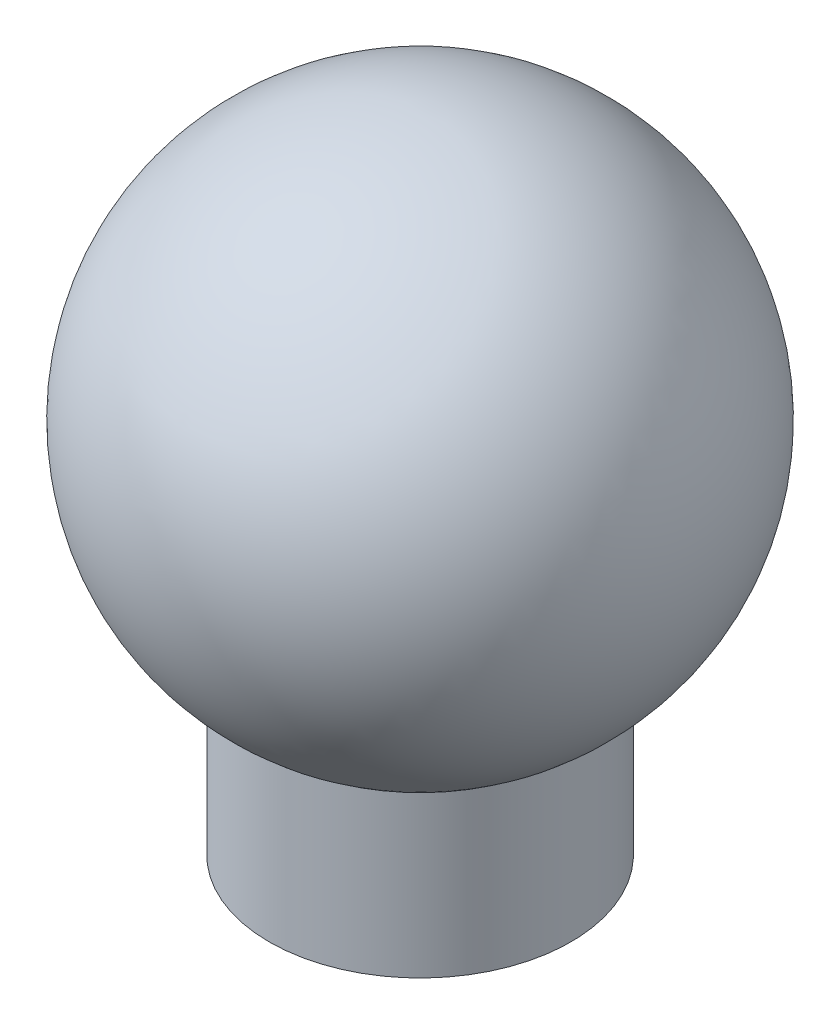
ISO-10303-21;
HEADER;
FILE_DESCRIPTION(('STEP AP214'),'2;1');
FILE_NAME('part.step','',(''),(''),'','','');
FILE_SCHEMA(('AUTOMOTIVE_DESIGN { 1 0 10303 214 1 1 1 1 }'));
ENDSEC;
DATA;
#1=APPLICATION_CONTEXT('core data for automotive mechanical design processes');
#2=APPLICATION_PROTOCOL_DEFINITION('international standard','automotive_design',2000,#1);
#3=PRODUCT_CONTEXT('',#1,'mechanical');
#4=PRODUCT('Part','Part','',(#3));
#5=PRODUCT_RELATED_PRODUCT_CATEGORY('part','',(#4));
#6=PRODUCT_DEFINITION_FORMATION('','',#4);
#7=PRODUCT_DEFINITION_CONTEXT('part definition',#1,'design');
#8=PRODUCT_DEFINITION('design','',#6,#7);
#9=PRODUCT_DEFINITION_SHAPE('','',#8);
#10=(LENGTH_UNIT() NAMED_UNIT(*) SI_UNIT(.MILLI.,.METRE.));
#11=(NAMED_UNIT(*) PLANE_ANGLE_UNIT() SI_UNIT($,.RADIAN.));
#12=(NAMED_UNIT(*) SI_UNIT($,.STERADIAN.) SOLID_ANGLE_UNIT());
#13=UNCERTAINTY_MEASURE_WITH_UNIT(LENGTH_MEASURE(1.E-05),#10,'distance_accuracy_value','');
#14=(GEOMETRIC_REPRESENTATION_CONTEXT(3) GLOBAL_UNCERTAINTY_ASSIGNED_CONTEXT((#13)) GLOBAL_UNIT_ASSIGNED_CONTEXT((#10,
#11,#12)) REPRESENTATION_CONTEXT('',''));
#15=CARTESIAN_POINT('',(0.,0.,0.));
#16=DIRECTION('',(0.,0.,1.));
#17=DIRECTION('',(1.,0.,0.));
#18=AXIS2_PLACEMENT_3D('',#15,#16,#17);
#19=CARTESIAN_POINT('',(0.,10.,0.));
#20=DIRECTION('',(0.,-1.,0.));
#21=DIRECTION('',(0.,0.,-1.));
#22=AXIS2_PLACEMENT_3D('',#19,#20,#21);
#23=CYLINDRICAL_SURFACE('',#22,4.);
#24=CARTESIAN_POINT('',(0.,0.,0.));
#25=DIRECTION('',(0.,1.,0.));
#26=DIRECTION('',(0.,0.,1.));
#27=AXIS2_PLACEMENT_3D('',#24,#25,#26);
#28=CIRCLE('',#27,4.);
#29=CARTESIAN_POINT('',(0.,0.,4.));
#30=VERTEX_POINT('',#29);
#31=EDGE_CURVE('E42',#30,#30,#28,.T.);
#32=ORIENTED_EDGE('',*,*,#31,.T.);
#33=EDGE_LOOP('',(#32));
#34=FACE_BOUND('',#33,.T.);
#35=CARTESIAN_POINT('',(0.,4.25543735346197,0.));
#36=DIRECTION('',(0.,1.,0.));
#37=DIRECTION('',(0.,0.,1.));
#38=AXIS2_PLACEMENT_3D('',#35,#36,#37);
#39=CIRCLE('',#38,4.);
#40=CARTESIAN_POINT('',(0.,4.25543735346197,4.));
#41=VERTEX_POINT('',#40);
#42=EDGE_CURVE('E11',#41,#41,#39,.T.);
#43=ORIENTED_EDGE('',*,*,#42,.F.);
#44=EDGE_LOOP('',(#43));
#45=FACE_BOUND('',#44,.T.);
#46=ADVANCED_FACE('F35',(#34,#45),#23,.T.);
#47=CARTESIAN_POINT('',(0.,0.,0.));
#48=DIRECTION('',(0.,1.,0.));
#49=DIRECTION('',(0.,0.,1.));
#50=AXIS2_PLACEMENT_3D('',#47,#48,#49);
#51=PLANE('',#50);
#52=DIRECTION('',(-0.530839382753659,0.,-0.847472447763179));
#53=VECTOR('',#52,1.);
#54=CARTESIAN_POINT('',(0.,0.,3.2));
#55=LINE('',#54,#53);
#56=CARTESIAN_POINT('',(0.,0.,3.2));
#57=VERTEX_POINT('',#56);
#58=CARTESIAN_POINT('',(-2.87917920685657,0.,-1.39654111819337));
#59=VERTEX_POINT('',#58);
#60=EDGE_CURVE('E68',#57,#59,#55,.T.);
#61=ORIENTED_EDGE('',*,*,#60,.F.);
#62=CARTESIAN_POINT('',(0.,0.,0.));
#63=DIRECTION('',(0.,-1.,0.));
#64=DIRECTION('',(0.,0.,-1.));
#65=AXIS2_PLACEMENT_3D('',#62,#63,#64);
#66=CIRCLE('',#65,3.2);
#67=EDGE_CURVE('E49',#59,#57,#66,.T.);
#68=ORIENTED_EDGE('',*,*,#67,.F.);
#69=EDGE_LOOP('',(#61,#68));
#70=FACE_BOUND('',#69,.T.);
#71=ORIENTED_EDGE('',*,*,#31,.F.);
#72=EDGE_LOOP('',(#71));
#73=FACE_BOUND('',#72,.T.);
#74=ADVANCED_FACE('F72',(#70,#73),#51,.F.);
#75=CARTESIAN_POINT('',(0.,10.,0.));
#76=DIRECTION('',(0.,0.,-1.));
#77=DIRECTION('',(1.,0.,0.));
#78=AXIS2_PLACEMENT_3D('',#75,#76,#77);
#79=SPHERICAL_SURFACE('',#78,7.);
#80=CARTESIAN_POINT('',(0.,10.,0.));
#81=DIRECTION('',(0.,1.,0.));
#82=DIRECTION('',(0.,0.,1.));
#83=AXIS2_PLACEMENT_3D('',#80,#81,#82);
#84=SPHERICAL_SURFACE('',#83,7.);
#85=ORIENTED_EDGE('',*,*,#42,.T.);
#86=EDGE_LOOP('',(#85));
#87=FACE_BOUND('',#86,.T.);
#88=ADVANCED_FACE('F84',(#87),#84,.T.);
#89=CARTESIAN_POINT('',(0.,7.,0.));
#90=DIRECTION('',(0.,-1.,0.));
#91=DIRECTION('',(0.,0.,-1.));
#92=AXIS2_PLACEMENT_3D('',#89,#90,#91);
#93=CYLINDRICAL_SURFACE('',#92,3.2);
#94=ORIENTED_EDGE('',*,*,#67,.T.);
#95=DIRECTION('',(0.,-1.,0.));
#96=VECTOR('',#95,1.);
#97=CARTESIAN_POINT('',(0.,7.,3.2));
#98=LINE('',#97,#96);
#99=CARTESIAN_POINT('',(0.,7.,3.2));
#100=VERTEX_POINT('',#99);
#101=EDGE_CURVE('E65',#100,#57,#98,.T.);
#102=ORIENTED_EDGE('',*,*,#101,.F.);
#103=CARTESIAN_POINT('',(0.,7.,0.));
#104=DIRECTION('',(0.,-1.,0.));
#105=DIRECTION('',(0.,0.,-1.));
#106=AXIS2_PLACEMENT_3D('',#103,#104,#105);
#107=CIRCLE('',#106,3.2);
#108=CARTESIAN_POINT('',(-2.87917920685657,7.,-1.39654111819337));
#109=VERTEX_POINT('',#108);
#110=EDGE_CURVE('E63',#109,#100,#107,.T.);
#111=ORIENTED_EDGE('',*,*,#110,.F.);
#112=DIRECTION('',(0.,-1.,0.));
#113=VECTOR('',#112,1.);
#114=CARTESIAN_POINT('',(-2.87917920685657,7.,-1.39654111819337));
#115=LINE('',#114,#113);
#116=EDGE_CURVE('E57',#109,#59,#115,.T.);
#117=ORIENTED_EDGE('',*,*,#116,.T.);
#118=EDGE_LOOP('',(#94,#102,#111,#117));
#119=FACE_BOUND('',#118,.T.);
#120=ADVANCED_FACE('F61',(#119),#93,.F.);
#121=CARTESIAN_POINT('',(0.,7.,3.2));
#122=DIRECTION('',(-0.847472447763179,0.,0.530839382753659));
#123=DIRECTION('',(0.530839382753659,0.,0.847472447763179));
#124=AXIS2_PLACEMENT_3D('',#121,#122,#123);
#125=PLANE('',#124);
#126=ORIENTED_EDGE('',*,*,#60,.T.);
#127=ORIENTED_EDGE('',*,*,#116,.F.);
#128=DIRECTION('',(-0.530839382753659,0.,-0.847472447763179));
#129=VECTOR('',#128,1.);
#130=CARTESIAN_POINT('',(0.,7.,3.2));
#131=LINE('',#130,#129);
#132=EDGE_CURVE('E76',#100,#109,#131,.T.);
#133=ORIENTED_EDGE('',*,*,#132,.F.);
#134=ORIENTED_EDGE('',*,*,#101,.T.);
#135=EDGE_LOOP('',(#126,#127,#133,#134));
#136=FACE_BOUND('',#135,.T.);
#137=ADVANCED_FACE('F69',(#136),#125,.F.);
#138=CARTESIAN_POINT('',(0.,7.,0.));
#139=DIRECTION('',(0.,-1.,0.));
#140=DIRECTION('',(0.,0.,-1.));
#141=AXIS2_PLACEMENT_3D('',#138,#139,#140);
#142=PLANE('',#141);
#143=ORIENTED_EDGE('',*,*,#110,.T.);
#144=ORIENTED_EDGE('',*,*,#132,.T.);
#145=EDGE_LOOP('',(#143,#144));
#146=FACE_BOUND('',#145,.T.);
#147=ADVANCED_FACE('F96',(#146),#142,.T.);
#148=CLOSED_SHELL('',(#46,#74,#88,#120,#137,#147));
#149=MANIFOLD_SOLID_BREP('B2',#148);
#150=ADVANCED_BREP_SHAPE_REPRESENTATION('',(#18,#149),#14);
#151=SHAPE_DEFINITION_REPRESENTATION(#9,#150);
ENDSEC;
END-ISO-10303-21;
